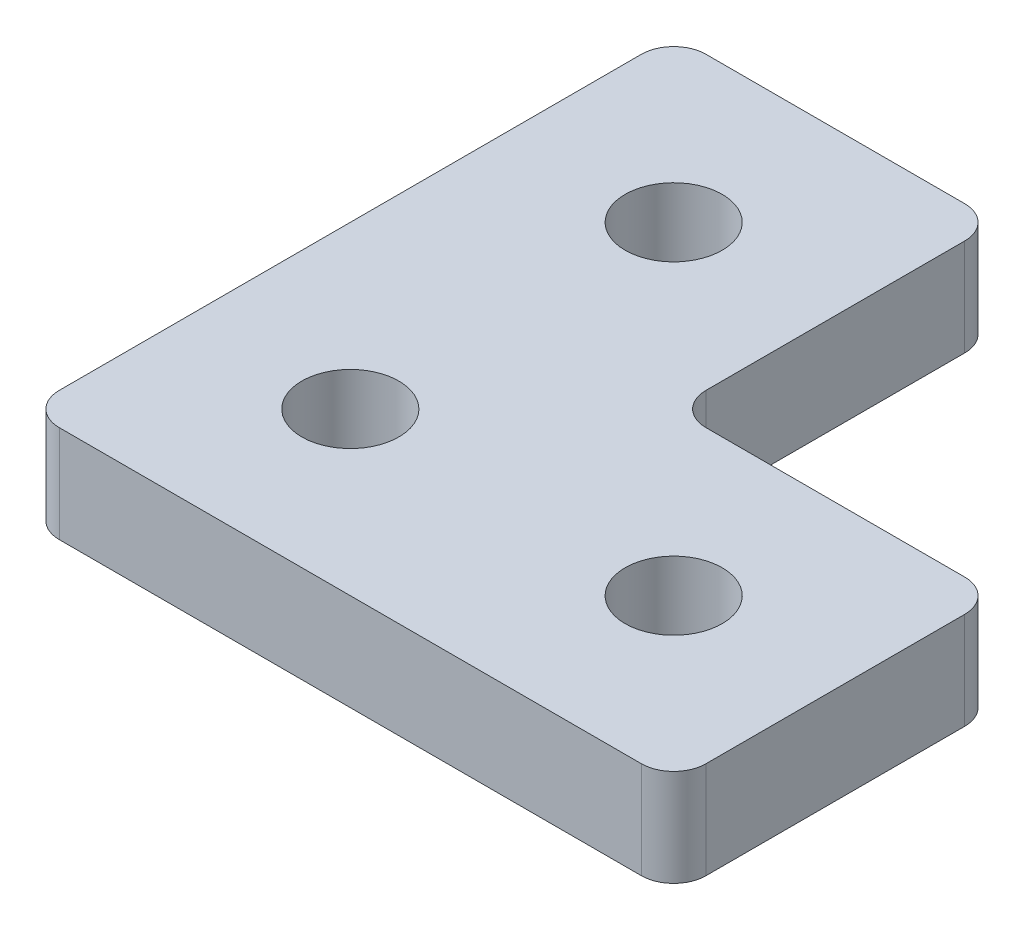
ISO-10303-21;
HEADER;
FILE_DESCRIPTION(('STEP AP214'),'2;1');
FILE_NAME('part.step','',(''),(''),'','','');
FILE_SCHEMA(('AUTOMOTIVE_DESIGN { 1 0 10303 214 1 1 1 1 }'));
ENDSEC;
DATA;
#1=APPLICATION_CONTEXT('core data for automotive mechanical design processes');
#2=APPLICATION_PROTOCOL_DEFINITION('international standard','automotive_design',2000,#1);
#3=PRODUCT_CONTEXT('',#1,'mechanical');
#4=PRODUCT('Part','Part','',(#3));
#5=PRODUCT_RELATED_PRODUCT_CATEGORY('part','',(#4));
#6=PRODUCT_DEFINITION_FORMATION('','',#4);
#7=PRODUCT_DEFINITION_CONTEXT('part definition',#1,'design');
#8=PRODUCT_DEFINITION('design','',#6,#7);
#9=PRODUCT_DEFINITION_SHAPE('','',#8);
#10=(LENGTH_UNIT() NAMED_UNIT(*) SI_UNIT(.MILLI.,.METRE.));
#11=(NAMED_UNIT(*) PLANE_ANGLE_UNIT() SI_UNIT($,.RADIAN.));
#12=(NAMED_UNIT(*) SI_UNIT($,.STERADIAN.) SOLID_ANGLE_UNIT());
#13=UNCERTAINTY_MEASURE_WITH_UNIT(LENGTH_MEASURE(1.E-05),#10,'distance_accuracy_value','');
#14=(GEOMETRIC_REPRESENTATION_CONTEXT(3) GLOBAL_UNCERTAINTY_ASSIGNED_CONTEXT((#13)) GLOBAL_UNIT_ASSIGNED_CONTEXT((#10,
#11,#12)) REPRESENTATION_CONTEXT('',''));
#15=CARTESIAN_POINT('',(0.,0.,0.));
#16=DIRECTION('',(0.,0.,1.));
#17=DIRECTION('',(1.,0.,0.));
#18=AXIS2_PLACEMENT_3D('',#15,#16,#17);
#19=CARTESIAN_POINT('',(0.,3.,0.));
#20=DIRECTION('',(0.,-1.,0.));
#21=DIRECTION('',(0.,0.,-1.));
#22=AXIS2_PLACEMENT_3D('',#19,#20,#21);
#23=PLANE('',#22);
#24=DIRECTION('',(-1.,0.,0.));
#25=VECTOR('',#24,1.);
#26=CARTESIAN_POINT('',(0.,3.,-20.));
#27=LINE('',#26,#25);
#28=CARTESIAN_POINT('',(9.00000000000003,3.,-20.));
#29=VERTEX_POINT('',#28);
#30=CARTESIAN_POINT('',(1.,3.,-20.));
#31=VERTEX_POINT('',#30);
#32=EDGE_CURVE('E147',#29,#31,#27,.T.);
#33=ORIENTED_EDGE('',*,*,#32,.T.);
#34=CARTESIAN_POINT('',(1.,3.,-19.));
#35=DIRECTION('',(0.,-1.,0.));
#36=DIRECTION('',(0.,0.,-1.));
#37=AXIS2_PLACEMENT_3D('',#34,#35,#36);
#38=CIRCLE('',#37,1.);
#39=CARTESIAN_POINT('',(0.,3.,-19.));
#40=VERTEX_POINT('',#39);
#41=EDGE_CURVE('E192',#31,#40,#38,.F.);
#42=ORIENTED_EDGE('',*,*,#41,.T.);
#43=DIRECTION('',(0.,0.,1.));
#44=VECTOR('',#43,1.);
#45=CARTESIAN_POINT('',(0.,3.,0.));
#46=LINE('',#45,#44);
#47=CARTESIAN_POINT('',(0.,3.,-1.00000000000001));
#48=VERTEX_POINT('',#47);
#49=EDGE_CURVE('E158',#40,#48,#46,.T.);
#50=ORIENTED_EDGE('',*,*,#49,.T.);
#51=CARTESIAN_POINT('',(0.999999999999999,3.,-1.00000000000001));
#52=DIRECTION('',(0.,-1.,0.));
#53=DIRECTION('',(0.,0.,-1.));
#54=AXIS2_PLACEMENT_3D('',#51,#52,#53);
#55=CIRCLE('',#54,1.);
#56=CARTESIAN_POINT('',(1.00000000000001,3.,0.));
#57=VERTEX_POINT('',#56);
#58=EDGE_CURVE('E188',#48,#57,#55,.F.);
#59=ORIENTED_EDGE('',*,*,#58,.T.);
#60=DIRECTION('',(1.,0.,0.));
#61=VECTOR('',#60,1.);
#62=CARTESIAN_POINT('',(0.,3.,0.));
#63=LINE('',#62,#61);
#64=CARTESIAN_POINT('',(19.0000000000004,3.,-1.97851021854865E-13));
#65=VERTEX_POINT('',#64);
#66=EDGE_CURVE('E227',#57,#65,#63,.T.);
#67=ORIENTED_EDGE('',*,*,#66,.T.);
#68=CARTESIAN_POINT('',(19.0000000000004,3.,-1.0000000000002));
#69=DIRECTION('',(0.,-1.,0.));
#70=DIRECTION('',(0.,0.,-1.));
#71=AXIS2_PLACEMENT_3D('',#68,#69,#70);
#72=CIRCLE('',#71,1.);
#73=CARTESIAN_POINT('',(20.0000000000004,3.,-1.00000000000021));
#74=VERTEX_POINT('',#73);
#75=EDGE_CURVE('E186',#65,#74,#72,.F.);
#76=ORIENTED_EDGE('',*,*,#75,.T.);
#77=DIRECTION('',(0.,0.,-1.));
#78=VECTOR('',#77,1.);
#79=CARTESIAN_POINT('',(20.0000000000004,3.,-2.08166817117216E-13));
#80=LINE('',#79,#78);
#81=CARTESIAN_POINT('',(20.0000000000003,3.,-9.00000000000021));
#82=VERTEX_POINT('',#81);
#83=EDGE_CURVE('E209',#74,#82,#80,.T.);
#84=ORIENTED_EDGE('',*,*,#83,.T.);
#85=CARTESIAN_POINT('',(19.0000000000003,3.,-9.0000000000002));
#86=DIRECTION('',(0.,-1.,0.));
#87=DIRECTION('',(0.,0.,-1.));
#88=AXIS2_PLACEMENT_3D('',#85,#86,#87);
#89=CIRCLE('',#88,1.);
#90=CARTESIAN_POINT('',(19.0000000000003,3.,-10.0000000000002));
#91=VERTEX_POINT('',#90);
#92=EDGE_CURVE('E62',#82,#91,#89,.F.);
#93=ORIENTED_EDGE('',*,*,#92,.T.);
#94=DIRECTION('',(-1.,0.,0.));
#95=VECTOR('',#94,1.);
#96=CARTESIAN_POINT('',(10.0000000000003,3.,-10.0000000000001));
#97=LINE('',#96,#95);
#98=CARTESIAN_POINT('',(11.0000000000003,3.,-10.0000000000001));
#99=VERTEX_POINT('',#98);
#100=EDGE_CURVE('E224',#91,#99,#97,.T.);
#101=ORIENTED_EDGE('',*,*,#100,.T.);
#102=CARTESIAN_POINT('',(11.0000000000003,3.,-11.0000000000001));
#103=DIRECTION('',(0.,-1.,0.));
#104=DIRECTION('',(0.,0.,-1.));
#105=AXIS2_PLACEMENT_3D('',#102,#103,#104);
#106=CIRCLE('',#105,1.);
#107=CARTESIAN_POINT('',(10.0000000000003,3.,-11.0000000000001));
#108=VERTEX_POINT('',#107);
#109=EDGE_CURVE('E142',#99,#108,#106,.T.);
#110=ORIENTED_EDGE('',*,*,#109,.T.);
#111=DIRECTION('',(0.,0.,-1.));
#112=VECTOR('',#111,1.);
#113=CARTESIAN_POINT('',(10.0000000000003,3.,-10.0000000000001));
#114=LINE('',#113,#112);
#115=CARTESIAN_POINT('',(10.,3.,-19.));
#116=VERTEX_POINT('',#115);
#117=EDGE_CURVE('E146',#108,#116,#114,.T.);
#118=ORIENTED_EDGE('',*,*,#117,.T.);
#119=CARTESIAN_POINT('',(9.00000000000003,3.,-19.));
#120=DIRECTION('',(0.,-1.,0.));
#121=DIRECTION('',(0.,0.,-1.));
#122=AXIS2_PLACEMENT_3D('',#119,#120,#121);
#123=CIRCLE('',#122,1.);
#124=EDGE_CURVE('E190',#116,#29,#123,.F.);
#125=ORIENTED_EDGE('',*,*,#124,.T.);
#126=EDGE_LOOP('',(#33,#42,#50,#59,#67,#76,#84,#93,#101,#110,#118,#125));
#127=FACE_BOUND('',#126,.T.);
#128=CARTESIAN_POINT('',(5.,3.,-15.0000000000001));
#129=DIRECTION('',(0.,1.,0.));
#130=DIRECTION('',(0.,0.,1.));
#131=AXIS2_PLACEMENT_3D('',#128,#129,#130);
#132=CIRCLE('',#131,1.49999999999998);
#133=CARTESIAN_POINT('',(5.,3.,-13.5000000000001));
#134=VERTEX_POINT('',#133);
#135=EDGE_CURVE('E220',#134,#134,#132,.T.);
#136=ORIENTED_EDGE('',*,*,#135,.F.);
#137=EDGE_LOOP('',(#136));
#138=FACE_BOUND('',#137,.T.);
#139=CARTESIAN_POINT('',(5.0000000000001,3.,-5.));
#140=DIRECTION('',(0.,1.,0.));
#141=DIRECTION('',(0.,0.,1.));
#142=AXIS2_PLACEMENT_3D('',#139,#140,#141);
#143=CIRCLE('',#142,1.5);
#144=CARTESIAN_POINT('',(5.0000000000001,3.,-3.5));
#145=VERTEX_POINT('',#144);
#146=EDGE_CURVE('E235',#145,#145,#143,.T.);
#147=ORIENTED_EDGE('',*,*,#146,.F.);
#148=EDGE_LOOP('',(#147));
#149=FACE_BOUND('',#148,.T.);
#150=CARTESIAN_POINT('',(15.0000000000004,3.,-5.00000000000016));
#151=DIRECTION('',(0.,1.,0.));
#152=DIRECTION('',(0.,0.,1.));
#153=AXIS2_PLACEMENT_3D('',#150,#151,#152);
#154=CIRCLE('',#153,1.5);
#155=CARTESIAN_POINT('',(15.0000000000004,3.,-3.50000000000016));
#156=VERTEX_POINT('',#155);
#157=EDGE_CURVE('E241',#156,#156,#154,.T.);
#158=ORIENTED_EDGE('',*,*,#157,.F.);
#159=EDGE_LOOP('',(#158));
#160=FACE_BOUND('',#159,.T.);
#161=ADVANCED_FACE('F39',(#127,#138,#149,#160),#23,.F.);
#162=CARTESIAN_POINT('',(0.,0.,0.));
#163=DIRECTION('',(0.,-1.,0.));
#164=DIRECTION('',(0.,0.,-1.));
#165=AXIS2_PLACEMENT_3D('',#162,#163,#164);
#166=PLANE('',#165);
#167=CARTESIAN_POINT('',(5.0000000000001,0.,-5.));
#168=DIRECTION('',(0.,1.,0.));
#169=DIRECTION('',(0.,0.,1.));
#170=AXIS2_PLACEMENT_3D('',#167,#168,#169);
#171=CIRCLE('',#170,1.5);
#172=CARTESIAN_POINT('',(5.0000000000001,0.,-3.5));
#173=VERTEX_POINT('',#172);
#174=EDGE_CURVE('E238',#173,#173,#171,.T.);
#175=ORIENTED_EDGE('',*,*,#174,.T.);
#176=EDGE_LOOP('',(#175));
#177=FACE_BOUND('',#176,.T.);
#178=DIRECTION('',(0.,0.,1.));
#179=VECTOR('',#178,1.);
#180=CARTESIAN_POINT('',(0.,0.,0.));
#181=LINE('',#180,#179);
#182=CARTESIAN_POINT('',(0.,0.,-19.));
#183=VERTEX_POINT('',#182);
#184=CARTESIAN_POINT('',(0.,0.,-1.00000000000001));
#185=VERTEX_POINT('',#184);
#186=EDGE_CURVE('E215',#183,#185,#181,.T.);
#187=ORIENTED_EDGE('',*,*,#186,.F.);
#188=CARTESIAN_POINT('',(1.,0.,-19.));
#189=DIRECTION('',(0.,-1.,0.));
#190=DIRECTION('',(0.,0.,-1.));
#191=AXIS2_PLACEMENT_3D('',#188,#189,#190);
#192=CIRCLE('',#191,1.);
#193=CARTESIAN_POINT('',(1.,0.,-20.));
#194=VERTEX_POINT('',#193);
#195=EDGE_CURVE('E178',#183,#194,#192,.T.);
#196=ORIENTED_EDGE('',*,*,#195,.T.);
#197=DIRECTION('',(-1.,0.,0.));
#198=VECTOR('',#197,1.);
#199=CARTESIAN_POINT('',(0.,0.,-20.));
#200=LINE('',#199,#198);
#201=CARTESIAN_POINT('',(9.00000000000003,0.,-20.));
#202=VERTEX_POINT('',#201);
#203=EDGE_CURVE('E154',#202,#194,#200,.T.);
#204=ORIENTED_EDGE('',*,*,#203,.F.);
#205=CARTESIAN_POINT('',(9.00000000000003,0.,-19.));
#206=DIRECTION('',(0.,-1.,0.));
#207=DIRECTION('',(0.,0.,-1.));
#208=AXIS2_PLACEMENT_3D('',#205,#206,#207);
#209=CIRCLE('',#208,1.);
#210=CARTESIAN_POINT('',(10.,0.,-19.));
#211=VERTEX_POINT('',#210);
#212=EDGE_CURVE('E153',#202,#211,#209,.T.);
#213=ORIENTED_EDGE('',*,*,#212,.T.);
#214=DIRECTION('',(0.,0.,-1.));
#215=VECTOR('',#214,1.);
#216=CARTESIAN_POINT('',(10.0000000000003,0.,-10.0000000000001));
#217=LINE('',#216,#215);
#218=CARTESIAN_POINT('',(10.0000000000003,0.,-11.0000000000001));
#219=VERTEX_POINT('',#218);
#220=EDGE_CURVE('E145',#219,#211,#217,.T.);
#221=ORIENTED_EDGE('',*,*,#220,.F.);
#222=CARTESIAN_POINT('',(11.0000000000003,0.,-11.0000000000001));
#223=DIRECTION('',(0.,-1.,0.));
#224=DIRECTION('',(0.,0.,-1.));
#225=AXIS2_PLACEMENT_3D('',#222,#223,#224);
#226=CIRCLE('',#225,1.);
#227=CARTESIAN_POINT('',(11.0000000000003,0.,-10.0000000000001));
#228=VERTEX_POINT('',#227);
#229=EDGE_CURVE('E132',#219,#228,#226,.F.);
#230=ORIENTED_EDGE('',*,*,#229,.T.);
#231=DIRECTION('',(-1.,0.,0.));
#232=VECTOR('',#231,1.);
#233=CARTESIAN_POINT('',(10.0000000000003,0.,-10.0000000000001));
#234=LINE('',#233,#232);
#235=CARTESIAN_POINT('',(19.0000000000003,0.,-10.0000000000002));
#236=VERTEX_POINT('',#235);
#237=EDGE_CURVE('E155',#236,#228,#234,.T.);
#238=ORIENTED_EDGE('',*,*,#237,.F.);
#239=CARTESIAN_POINT('',(19.0000000000003,0.,-9.0000000000002));
#240=DIRECTION('',(0.,-1.,0.));
#241=DIRECTION('',(0.,0.,-1.));
#242=AXIS2_PLACEMENT_3D('',#239,#240,#241);
#243=CIRCLE('',#242,1.);
#244=CARTESIAN_POINT('',(20.0000000000003,0.,-9.00000000000021));
#245=VERTEX_POINT('',#244);
#246=EDGE_CURVE('E171',#236,#245,#243,.T.);
#247=ORIENTED_EDGE('',*,*,#246,.T.);
#248=DIRECTION('',(0.,0.,-1.));
#249=VECTOR('',#248,1.);
#250=CARTESIAN_POINT('',(20.0000000000004,0.,-2.08166817117216E-13));
#251=LINE('',#250,#249);
#252=CARTESIAN_POINT('',(20.0000000000004,0.,-1.00000000000021));
#253=VERTEX_POINT('',#252);
#254=EDGE_CURVE('E160',#253,#245,#251,.T.);
#255=ORIENTED_EDGE('',*,*,#254,.F.);
#256=CARTESIAN_POINT('',(19.0000000000004,0.,-1.0000000000002));
#257=DIRECTION('',(0.,-1.,0.));
#258=DIRECTION('',(0.,0.,-1.));
#259=AXIS2_PLACEMENT_3D('',#256,#257,#258);
#260=CIRCLE('',#259,1.);
#261=CARTESIAN_POINT('',(19.0000000000004,0.,-1.97763347082067E-13));
#262=VERTEX_POINT('',#261);
#263=EDGE_CURVE('E173',#253,#262,#260,.T.);
#264=ORIENTED_EDGE('',*,*,#263,.T.);
#265=DIRECTION('',(1.,0.,0.));
#266=VECTOR('',#265,1.);
#267=CARTESIAN_POINT('',(10.0000000000004,0.,-1.0413211676572E-13));
#268=LINE('',#267,#266);
#269=CARTESIAN_POINT('',(1.00000000000001,0.,0.));
#270=VERTEX_POINT('',#269);
#271=EDGE_CURVE('E214',#270,#262,#268,.T.);
#272=ORIENTED_EDGE('',*,*,#271,.F.);
#273=CARTESIAN_POINT('',(0.999999999999999,0.,-1.00000000000001));
#274=DIRECTION('',(0.,-1.,0.));
#275=DIRECTION('',(0.,0.,-1.));
#276=AXIS2_PLACEMENT_3D('',#273,#274,#275);
#277=CIRCLE('',#276,1.);
#278=EDGE_CURVE('E175',#270,#185,#277,.T.);
#279=ORIENTED_EDGE('',*,*,#278,.T.);
#280=EDGE_LOOP('',(#187,#196,#204,#213,#221,#230,#238,#247,#255,#264,#272,#279));
#281=FACE_BOUND('',#280,.T.);
#282=CARTESIAN_POINT('',(5.,0.,-15.0000000000001));
#283=DIRECTION('',(0.,1.,0.));
#284=DIRECTION('',(0.,0.,1.));
#285=AXIS2_PLACEMENT_3D('',#282,#283,#284);
#286=CIRCLE('',#285,1.49999999999998);
#287=CARTESIAN_POINT('',(5.,0.,-13.5000000000001));
#288=VERTEX_POINT('',#287);
#289=EDGE_CURVE('E232',#288,#288,#286,.T.);
#290=ORIENTED_EDGE('',*,*,#289,.T.);
#291=EDGE_LOOP('',(#290));
#292=FACE_BOUND('',#291,.T.);
#293=CARTESIAN_POINT('',(15.0000000000004,0.,-5.00000000000016));
#294=DIRECTION('',(0.,1.,0.));
#295=DIRECTION('',(0.,0.,1.));
#296=AXIS2_PLACEMENT_3D('',#293,#294,#295);
#297=CIRCLE('',#296,1.5);
#298=CARTESIAN_POINT('',(15.0000000000004,0.,-3.50000000000016));
#299=VERTEX_POINT('',#298);
#300=EDGE_CURVE('E244',#299,#299,#297,.T.);
#301=ORIENTED_EDGE('',*,*,#300,.T.);
#302=EDGE_LOOP('',(#301));
#303=FACE_BOUND('',#302,.T.);
#304=ADVANCED_FACE('F150',(#177,#281,#292,#303),#166,.T.);
#305=CARTESIAN_POINT('',(0.,3.,0.));
#306=DIRECTION('',(1.,0.,0.));
#307=DIRECTION('',(0.,0.,-1.));
#308=AXIS2_PLACEMENT_3D('',#305,#306,#307);
#309=PLANE('',#308);
#310=ORIENTED_EDGE('',*,*,#49,.F.);
#311=DIRECTION('',(0.,-1.,0.));
#312=VECTOR('',#311,1.);
#313=CARTESIAN_POINT('',(0.,3.,-19.));
#314=LINE('',#313,#312);
#315=EDGE_CURVE('E168',#40,#183,#314,.T.);
#316=ORIENTED_EDGE('',*,*,#315,.T.);
#317=ORIENTED_EDGE('',*,*,#186,.T.);
#318=DIRECTION('',(0.,-1.,0.));
#319=VECTOR('',#318,1.);
#320=CARTESIAN_POINT('',(0.,3.,-1.00000000000001));
#321=LINE('',#320,#319);
#322=EDGE_CURVE('E166',#185,#48,#321,.F.);
#323=ORIENTED_EDGE('',*,*,#322,.T.);
#324=EDGE_LOOP('',(#310,#316,#317,#323));
#325=FACE_BOUND('',#324,.T.);
#326=ADVANCED_FACE('F259',(#325),#309,.F.);
#327=CARTESIAN_POINT('',(10.0000000000004,3.,-1.0413211676572E-13));
#328=DIRECTION('',(0.,0.,-1.));
#329=DIRECTION('',(-1.,0.,0.));
#330=AXIS2_PLACEMENT_3D('',#327,#328,#329);
#331=PLANE('',#330);
#332=ORIENTED_EDGE('',*,*,#66,.F.);
#333=DIRECTION('',(0.,-1.,0.));
#334=VECTOR('',#333,1.);
#335=CARTESIAN_POINT('',(1.00000000000001,3.,0.));
#336=LINE('',#335,#334);
#337=EDGE_CURVE('E197',#57,#270,#336,.T.);
#338=ORIENTED_EDGE('',*,*,#337,.T.);
#339=ORIENTED_EDGE('',*,*,#271,.T.);
#340=DIRECTION('',(0.,-1.,0.));
#341=VECTOR('',#340,1.);
#342=CARTESIAN_POINT('',(19.0000000000004,3.,-1.97763347082067E-13));
#343=LINE('',#342,#341);
#344=EDGE_CURVE('E195',#262,#65,#343,.F.);
#345=ORIENTED_EDGE('',*,*,#344,.T.);
#346=EDGE_LOOP('',(#332,#338,#339,#345));
#347=FACE_BOUND('',#346,.T.);
#348=ADVANCED_FACE('F279',(#347),#331,.F.);
#349=CARTESIAN_POINT('',(20.0000000000004,3.,-2.08166817117216E-13));
#350=DIRECTION('',(-1.,0.,0.));
#351=DIRECTION('',(0.,0.,1.));
#352=AXIS2_PLACEMENT_3D('',#349,#350,#351);
#353=PLANE('',#352);
#354=ORIENTED_EDGE('',*,*,#83,.F.);
#355=DIRECTION('',(0.,-1.,0.));
#356=VECTOR('',#355,1.);
#357=CARTESIAN_POINT('',(20.0000000000004,3.,-1.00000000000021));
#358=LINE('',#357,#356);
#359=EDGE_CURVE('E47',#74,#253,#358,.T.);
#360=ORIENTED_EDGE('',*,*,#359,.T.);
#361=ORIENTED_EDGE('',*,*,#254,.T.);
#362=DIRECTION('',(0.,-1.,0.));
#363=VECTOR('',#362,1.);
#364=CARTESIAN_POINT('',(20.0000000000003,3.,-9.00000000000021));
#365=LINE('',#364,#363);
#366=EDGE_CURVE('E200',#245,#82,#365,.F.);
#367=ORIENTED_EDGE('',*,*,#366,.T.);
#368=EDGE_LOOP('',(#354,#360,#361,#367));
#369=FACE_BOUND('',#368,.T.);
#370=ADVANCED_FACE('F207',(#369),#353,.F.);
#371=CARTESIAN_POINT('',(10.0000000000003,3.,-10.0000000000001));
#372=DIRECTION('',(0.,0.,1.));
#373=DIRECTION('',(1.,0.,0.));
#374=AXIS2_PLACEMENT_3D('',#371,#372,#373);
#375=PLANE('',#374);
#376=ORIENTED_EDGE('',*,*,#100,.F.);
#377=DIRECTION('',(0.,-1.,0.));
#378=VECTOR('',#377,1.);
#379=CARTESIAN_POINT('',(19.0000000000003,3.,-10.0000000000002));
#380=LINE('',#379,#378);
#381=EDGE_CURVE('E11',#91,#236,#380,.T.);
#382=ORIENTED_EDGE('',*,*,#381,.T.);
#383=ORIENTED_EDGE('',*,*,#237,.T.);
#384=DIRECTION('',(0.,-1.,0.));
#385=VECTOR('',#384,1.);
#386=CARTESIAN_POINT('',(11.0000000000003,3.,-10.0000000000001));
#387=LINE('',#386,#385);
#388=EDGE_CURVE('E138',#228,#99,#387,.F.);
#389=ORIENTED_EDGE('',*,*,#388,.T.);
#390=EDGE_LOOP('',(#376,#382,#383,#389));
#391=FACE_BOUND('',#390,.T.);
#392=ADVANCED_FACE('F273',(#391),#375,.F.);
#393=CARTESIAN_POINT('',(10.0000000000003,3.,-10.0000000000001));
#394=DIRECTION('',(-1.,0.,0.));
#395=DIRECTION('',(0.,0.,1.));
#396=AXIS2_PLACEMENT_3D('',#393,#394,#395);
#397=PLANE('',#396);
#398=ORIENTED_EDGE('',*,*,#220,.T.);
#399=DIRECTION('',(0.,-1.,0.));
#400=VECTOR('',#399,1.);
#401=CARTESIAN_POINT('',(10.,3.,-19.));
#402=LINE('',#401,#400);
#403=EDGE_CURVE('E54',#211,#116,#402,.F.);
#404=ORIENTED_EDGE('',*,*,#403,.T.);
#405=ORIENTED_EDGE('',*,*,#117,.F.);
#406=DIRECTION('',(0.,-1.,0.));
#407=VECTOR('',#406,1.);
#408=CARTESIAN_POINT('',(10.0000000000003,0.,-11.0000000000001));
#409=LINE('',#408,#407);
#410=EDGE_CURVE('E136',#108,#219,#409,.T.);
#411=ORIENTED_EDGE('',*,*,#410,.T.);
#412=EDGE_LOOP('',(#398,#404,#405,#411));
#413=FACE_BOUND('',#412,.T.);
#414=ADVANCED_FACE('F144',(#413),#397,.F.);
#415=CARTESIAN_POINT('',(0.,3.,-20.));
#416=DIRECTION('',(0.,0.,1.));
#417=DIRECTION('',(1.,0.,0.));
#418=AXIS2_PLACEMENT_3D('',#415,#416,#417);
#419=PLANE('',#418);
#420=ORIENTED_EDGE('',*,*,#203,.T.);
#421=DIRECTION('',(0.,-1.,0.));
#422=VECTOR('',#421,1.);
#423=CARTESIAN_POINT('',(1.,3.,-20.));
#424=LINE('',#423,#422);
#425=EDGE_CURVE('E183',#194,#31,#424,.F.);
#426=ORIENTED_EDGE('',*,*,#425,.T.);
#427=ORIENTED_EDGE('',*,*,#32,.F.);
#428=DIRECTION('',(0.,-1.,0.));
#429=VECTOR('',#428,1.);
#430=CARTESIAN_POINT('',(9.00000000000003,3.,-20.));
#431=LINE('',#430,#429);
#432=EDGE_CURVE('E180',#29,#202,#431,.T.);
#433=ORIENTED_EDGE('',*,*,#432,.T.);
#434=EDGE_LOOP('',(#420,#426,#427,#433));
#435=FACE_BOUND('',#434,.T.);
#436=ADVANCED_FACE('F267',(#435),#419,.F.);
#437=CARTESIAN_POINT('',(5.,3.,-15.0000000000001));
#438=DIRECTION('',(0.,-1.,0.));
#439=DIRECTION('',(0.,0.,-1.));
#440=AXIS2_PLACEMENT_3D('',#437,#438,#439);
#441=CYLINDRICAL_SURFACE('',#440,1.49999999999998);
#442=ORIENTED_EDGE('',*,*,#135,.T.);
#443=EDGE_LOOP('',(#442));
#444=FACE_BOUND('',#443,.T.);
#445=ORIENTED_EDGE('',*,*,#289,.F.);
#446=EDGE_LOOP('',(#445));
#447=FACE_BOUND('',#446,.T.);
#448=ADVANCED_FACE('F264',(#444,#447),#441,.F.);
#449=CARTESIAN_POINT('',(5.0000000000001,3.,-5.));
#450=DIRECTION('',(0.,-1.,0.));
#451=DIRECTION('',(0.,0.,-1.));
#452=AXIS2_PLACEMENT_3D('',#449,#450,#451);
#453=CYLINDRICAL_SURFACE('',#452,1.5);
#454=ORIENTED_EDGE('',*,*,#146,.T.);
#455=EDGE_LOOP('',(#454));
#456=FACE_BOUND('',#455,.T.);
#457=ORIENTED_EDGE('',*,*,#174,.F.);
#458=EDGE_LOOP('',(#457));
#459=FACE_BOUND('',#458,.T.);
#460=ADVANCED_FACE('F357',(#456,#459),#453,.F.);
#461=CARTESIAN_POINT('',(15.0000000000004,3.,-5.00000000000016));
#462=DIRECTION('',(0.,-1.,0.));
#463=DIRECTION('',(0.,0.,-1.));
#464=AXIS2_PLACEMENT_3D('',#461,#462,#463);
#465=CYLINDRICAL_SURFACE('',#464,1.5);
#466=ORIENTED_EDGE('',*,*,#157,.T.);
#467=EDGE_LOOP('',(#466));
#468=FACE_BOUND('',#467,.T.);
#469=ORIENTED_EDGE('',*,*,#300,.F.);
#470=EDGE_LOOP('',(#469));
#471=FACE_BOUND('',#470,.T.);
#472=ADVANCED_FACE('F250',(#468,#471),#465,.F.);
#473=CARTESIAN_POINT('',(11.0000000000003,3.,-11.0000000000001));
#474=DIRECTION('',(0.,1.,0.));
#475=DIRECTION('',(0.,0.,1.));
#476=AXIS2_PLACEMENT_3D('',#473,#474,#475);
#477=CYLINDRICAL_SURFACE('',#476,1.);
#478=ORIENTED_EDGE('',*,*,#109,.F.);
#479=ORIENTED_EDGE('',*,*,#388,.F.);
#480=ORIENTED_EDGE('',*,*,#229,.F.);
#481=ORIENTED_EDGE('',*,*,#410,.F.);
#482=EDGE_LOOP('',(#478,#479,#480,#481));
#483=FACE_BOUND('',#482,.T.);
#484=ADVANCED_FACE('F135',(#483),#477,.F.);
#485=CARTESIAN_POINT('',(1.,3.,-19.));
#486=DIRECTION('',(0.,-1.,0.));
#487=DIRECTION('',(0.,0.,-1.));
#488=AXIS2_PLACEMENT_3D('',#485,#486,#487);
#489=CYLINDRICAL_SURFACE('',#488,1.);
#490=ORIENTED_EDGE('',*,*,#41,.F.);
#491=ORIENTED_EDGE('',*,*,#425,.F.);
#492=ORIENTED_EDGE('',*,*,#195,.F.);
#493=ORIENTED_EDGE('',*,*,#315,.F.);
#494=EDGE_LOOP('',(#490,#491,#492,#493));
#495=FACE_BOUND('',#494,.T.);
#496=ADVANCED_FACE('F287',(#495),#489,.T.);
#497=CARTESIAN_POINT('',(9.00000000000003,3.,-19.));
#498=DIRECTION('',(0.,-1.,0.));
#499=DIRECTION('',(0.,0.,-1.));
#500=AXIS2_PLACEMENT_3D('',#497,#498,#499);
#501=CYLINDRICAL_SURFACE('',#500,1.);
#502=ORIENTED_EDGE('',*,*,#124,.F.);
#503=ORIENTED_EDGE('',*,*,#403,.F.);
#504=ORIENTED_EDGE('',*,*,#212,.F.);
#505=ORIENTED_EDGE('',*,*,#432,.F.);
#506=EDGE_LOOP('',(#502,#503,#504,#505));
#507=FACE_BOUND('',#506,.T.);
#508=ADVANCED_FACE('F290',(#507),#501,.T.);
#509=CARTESIAN_POINT('',(0.999999999999999,3.,-1.00000000000001));
#510=DIRECTION('',(0.,-1.,0.));
#511=DIRECTION('',(0.,0.,-1.));
#512=AXIS2_PLACEMENT_3D('',#509,#510,#511);
#513=CYLINDRICAL_SURFACE('',#512,1.);
#514=ORIENTED_EDGE('',*,*,#58,.F.);
#515=ORIENTED_EDGE('',*,*,#322,.F.);
#516=ORIENTED_EDGE('',*,*,#278,.F.);
#517=ORIENTED_EDGE('',*,*,#337,.F.);
#518=EDGE_LOOP('',(#514,#515,#516,#517));
#519=FACE_BOUND('',#518,.T.);
#520=ADVANCED_FACE('F294',(#519),#513,.T.);
#521=CARTESIAN_POINT('',(19.0000000000004,3.,-1.0000000000002));
#522=DIRECTION('',(0.,-1.,0.));
#523=DIRECTION('',(0.,0.,-1.));
#524=AXIS2_PLACEMENT_3D('',#521,#522,#523);
#525=CYLINDRICAL_SURFACE('',#524,1.);
#526=ORIENTED_EDGE('',*,*,#75,.F.);
#527=ORIENTED_EDGE('',*,*,#344,.F.);
#528=ORIENTED_EDGE('',*,*,#263,.F.);
#529=ORIENTED_EDGE('',*,*,#359,.F.);
#530=EDGE_LOOP('',(#526,#527,#528,#529));
#531=FACE_BOUND('',#530,.T.);
#532=ADVANCED_FACE('F297',(#531),#525,.T.);
#533=CARTESIAN_POINT('',(19.0000000000003,3.,-9.0000000000002));
#534=DIRECTION('',(0.,-1.,0.));
#535=DIRECTION('',(0.,0.,-1.));
#536=AXIS2_PLACEMENT_3D('',#533,#534,#535);
#537=CYLINDRICAL_SURFACE('',#536,1.);
#538=ORIENTED_EDGE('',*,*,#92,.F.);
#539=ORIENTED_EDGE('',*,*,#366,.F.);
#540=ORIENTED_EDGE('',*,*,#246,.F.);
#541=ORIENTED_EDGE('',*,*,#381,.F.);
#542=EDGE_LOOP('',(#538,#539,#540,#541));
#543=FACE_BOUND('',#542,.T.);
#544=ADVANCED_FACE('F41',(#543),#537,.T.);
#545=CLOSED_SHELL('',(#161,#304,#326,#348,#370,#392,#414,#436,#448,#460,#472,#484,#496,#508,
#520,#532,#544));
#546=MANIFOLD_SOLID_BREP('B2',#545);
#547=ADVANCED_BREP_SHAPE_REPRESENTATION('',(#18,#546),#14);
#548=SHAPE_DEFINITION_REPRESENTATION(#9,#547);
ENDSEC;
END-ISO-10303-21;
